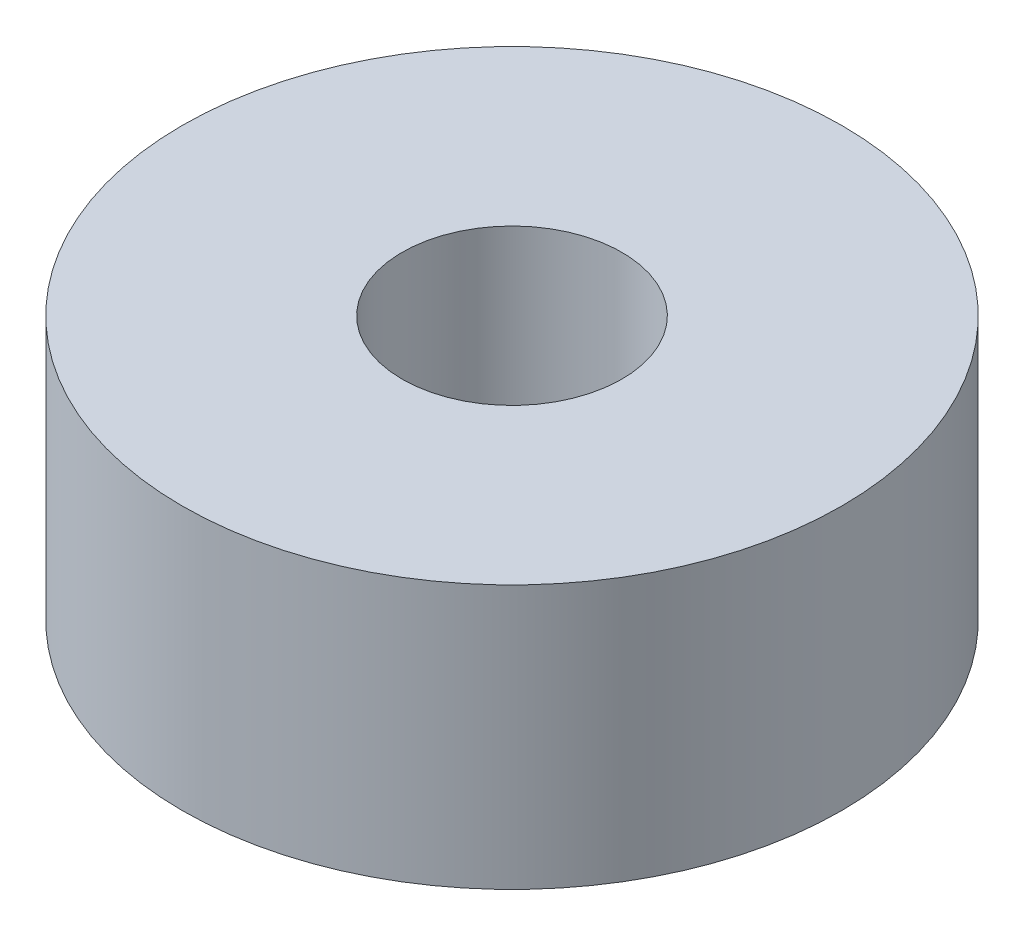
ISO-10303-21;
HEADER;
FILE_DESCRIPTION(('STEP AP214'),'2;1');
FILE_NAME('part.step','',(''),(''),'','','');
FILE_SCHEMA(('AUTOMOTIVE_DESIGN { 1 0 10303 214 1 1 1 1 }'));
ENDSEC;
DATA;
#1=APPLICATION_CONTEXT('core data for automotive mechanical design processes');
#2=APPLICATION_PROTOCOL_DEFINITION('international standard','automotive_design',2000,#1);
#3=PRODUCT_CONTEXT('',#1,'mechanical');
#4=PRODUCT('Part','Part','',(#3));
#5=PRODUCT_RELATED_PRODUCT_CATEGORY('part','',(#4));
#6=PRODUCT_DEFINITION_FORMATION('','',#4);
#7=PRODUCT_DEFINITION_CONTEXT('part definition',#1,'design');
#8=PRODUCT_DEFINITION('design','',#6,#7);
#9=PRODUCT_DEFINITION_SHAPE('','',#8);
#10=(LENGTH_UNIT() NAMED_UNIT(*) SI_UNIT(.MILLI.,.METRE.));
#11=(NAMED_UNIT(*) PLANE_ANGLE_UNIT() SI_UNIT($,.RADIAN.));
#12=(NAMED_UNIT(*) SI_UNIT($,.STERADIAN.) SOLID_ANGLE_UNIT());
#13=UNCERTAINTY_MEASURE_WITH_UNIT(LENGTH_MEASURE(1.E-05),#10,'distance_accuracy_value','');
#14=(GEOMETRIC_REPRESENTATION_CONTEXT(3) GLOBAL_UNCERTAINTY_ASSIGNED_CONTEXT((#13)) GLOBAL_UNIT_ASSIGNED_CONTEXT((#10,
#11,#12)) REPRESENTATION_CONTEXT('',''));
#15=CARTESIAN_POINT('',(0.,0.,0.));
#16=DIRECTION('',(0.,0.,1.));
#17=DIRECTION('',(1.,0.,0.));
#18=AXIS2_PLACEMENT_3D('',#15,#16,#17);
#19=CARTESIAN_POINT('',(0.,6.,0.));
#20=DIRECTION('',(0.,1.,0.));
#21=DIRECTION('',(0.,0.,1.));
#22=AXIS2_PLACEMENT_3D('',#19,#20,#21);
#23=PLANE('',#22);
#24=CARTESIAN_POINT('',(0.,6.,0.));
#25=DIRECTION('',(0.,1.,0.));
#26=DIRECTION('',(0.,0.,1.));
#27=AXIS2_PLACEMENT_3D('',#24,#25,#26);
#28=CIRCLE('',#27,7.5);
#29=CARTESIAN_POINT('',(0.,6.,7.5));
#30=VERTEX_POINT('',#29);
#31=EDGE_CURVE('E10',#30,#30,#28,.T.);
#32=ORIENTED_EDGE('',*,*,#31,.T.);
#33=EDGE_LOOP('',(#32));
#34=FACE_BOUND('',#33,.T.);
#35=CARTESIAN_POINT('',(0.,6.,0.));
#36=DIRECTION('',(0.,1.,0.));
#37=DIRECTION('',(0.,0.,1.));
#38=AXIS2_PLACEMENT_3D('',#35,#36,#37);
#39=CIRCLE('',#38,2.5);
#40=CARTESIAN_POINT('',(0.,6.,2.5));
#41=VERTEX_POINT('',#40);
#42=EDGE_CURVE('E58',#41,#41,#39,.T.);
#43=ORIENTED_EDGE('',*,*,#42,.F.);
#44=EDGE_LOOP('',(#43));
#45=FACE_BOUND('',#44,.T.);
#46=ADVANCED_FACE('F45',(#34,#45),#23,.T.);
#47=CARTESIAN_POINT('',(0.,0.,0.));
#48=DIRECTION('',(0.,1.,0.));
#49=DIRECTION('',(0.,0.,1.));
#50=AXIS2_PLACEMENT_3D('',#47,#48,#49);
#51=PLANE('',#50);
#52=CARTESIAN_POINT('',(0.,0.,0.));
#53=DIRECTION('',(0.,1.,0.));
#54=DIRECTION('',(0.,0.,1.));
#55=AXIS2_PLACEMENT_3D('',#52,#53,#54);
#56=CIRCLE('',#55,7.5);
#57=CARTESIAN_POINT('',(0.,0.,7.5));
#58=VERTEX_POINT('',#57);
#59=EDGE_CURVE('E49',#58,#58,#56,.T.);
#60=ORIENTED_EDGE('',*,*,#59,.F.);
#61=EDGE_LOOP('',(#60));
#62=FACE_BOUND('',#61,.T.);
#63=CARTESIAN_POINT('',(0.,0.,0.));
#64=DIRECTION('',(0.,1.,0.));
#65=DIRECTION('',(0.,0.,1.));
#66=AXIS2_PLACEMENT_3D('',#63,#64,#65);
#67=CIRCLE('',#66,2.5);
#68=CARTESIAN_POINT('',(0.,0.,2.5));
#69=VERTEX_POINT('',#68);
#70=EDGE_CURVE('E60',#69,#69,#67,.T.);
#71=ORIENTED_EDGE('',*,*,#70,.T.);
#72=EDGE_LOOP('',(#71));
#73=FACE_BOUND('',#72,.T.);
#74=ADVANCED_FACE('F72',(#62,#73),#51,.F.);
#75=CARTESIAN_POINT('',(0.,6.,0.));
#76=DIRECTION('',(0.,-1.,0.));
#77=DIRECTION('',(0.,0.,-1.));
#78=AXIS2_PLACEMENT_3D('',#75,#76,#77);
#79=CYLINDRICAL_SURFACE('',#78,7.5);
#80=ORIENTED_EDGE('',*,*,#31,.F.);
#81=EDGE_LOOP('',(#80));
#82=FACE_BOUND('',#81,.T.);
#83=ORIENTED_EDGE('',*,*,#59,.T.);
#84=EDGE_LOOP('',(#83));
#85=FACE_BOUND('',#84,.T.);
#86=ADVANCED_FACE('F47',(#82,#85),#79,.T.);
#87=CARTESIAN_POINT('',(0.,6.,0.));
#88=DIRECTION('',(0.,-1.,0.));
#89=DIRECTION('',(0.,0.,-1.));
#90=AXIS2_PLACEMENT_3D('',#87,#88,#89);
#91=CYLINDRICAL_SURFACE('',#90,2.5);
#92=ORIENTED_EDGE('',*,*,#42,.T.);
#93=EDGE_LOOP('',(#92));
#94=FACE_BOUND('',#93,.T.);
#95=ORIENTED_EDGE('',*,*,#70,.F.);
#96=EDGE_LOOP('',(#95));
#97=FACE_BOUND('',#96,.T.);
#98=ADVANCED_FACE('F68',(#94,#97),#91,.F.);
#99=CLOSED_SHELL('',(#46,#74,#86,#98));
#100=MANIFOLD_SOLID_BREP('B2',#99);
#101=ADVANCED_BREP_SHAPE_REPRESENTATION('',(#18,#100),#14);
#102=SHAPE_DEFINITION_REPRESENTATION(#9,#101);
ENDSEC;
END-ISO-10303-21;
